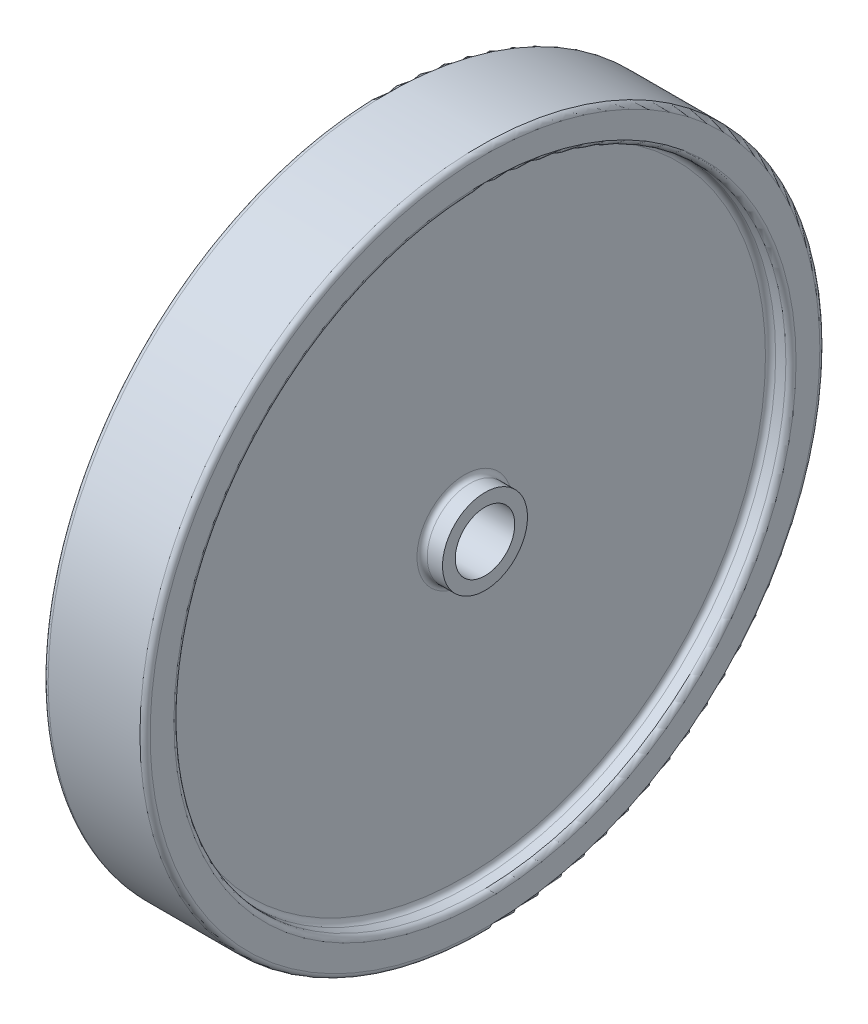
ISO-10303-21;
HEADER;
FILE_DESCRIPTION(('STEP AP214'),'2;1');
FILE_NAME('part.step','',(''),(''),'','','');
FILE_SCHEMA(('AUTOMOTIVE_DESIGN { 1 0 10303 214 1 1 1 1 }'));
ENDSEC;
DATA;
#1=APPLICATION_CONTEXT('core data for automotive mechanical design processes');
#2=APPLICATION_PROTOCOL_DEFINITION('international standard','automotive_design',2000,#1);
#3=PRODUCT_CONTEXT('',#1,'mechanical');
#4=PRODUCT('Part','Part','',(#3));
#5=PRODUCT_RELATED_PRODUCT_CATEGORY('part','',(#4));
#6=PRODUCT_DEFINITION_FORMATION('','',#4);
#7=PRODUCT_DEFINITION_CONTEXT('part definition',#1,'design');
#8=PRODUCT_DEFINITION('design','',#6,#7);
#9=PRODUCT_DEFINITION_SHAPE('','',#8);
#10=(LENGTH_UNIT() NAMED_UNIT(*) SI_UNIT(.MILLI.,.METRE.));
#11=(NAMED_UNIT(*) PLANE_ANGLE_UNIT() SI_UNIT($,.RADIAN.));
#12=(NAMED_UNIT(*) SI_UNIT($,.STERADIAN.) SOLID_ANGLE_UNIT());
#13=UNCERTAINTY_MEASURE_WITH_UNIT(LENGTH_MEASURE(1.E-05),#10,'distance_accuracy_value','');
#14=(GEOMETRIC_REPRESENTATION_CONTEXT(3) GLOBAL_UNCERTAINTY_ASSIGNED_CONTEXT((#13)) GLOBAL_UNIT_ASSIGNED_CONTEXT((#10,
#11,#12)) REPRESENTATION_CONTEXT('',''));
#15=CARTESIAN_POINT('',(0.,0.,0.));
#16=DIRECTION('',(0.,0.,1.));
#17=DIRECTION('',(1.,0.,0.));
#18=AXIS2_PLACEMENT_3D('',#15,#16,#17);
#19=CARTESIAN_POINT('',(0.,0.,0.));
#20=DIRECTION('',(1.,0.,0.));
#21=DIRECTION('',(0.,0.,-1.));
#22=AXIS2_PLACEMENT_3D('',#19,#20,#21);
#23=PLANE('',#22);
#24=CARTESIAN_POINT('',(0.,0.,0.));
#25=DIRECTION('',(1.,0.,0.));
#26=DIRECTION('',(0.,0.,-1.));
#27=AXIS2_PLACEMENT_3D('',#24,#25,#26);
#28=CIRCLE('',#27,17.5);
#29=CARTESIAN_POINT('',(0.,0.,-17.5));
#30=VERTEX_POINT('',#29);
#31=EDGE_CURVE('E91',#30,#30,#28,.T.);
#32=ORIENTED_EDGE('',*,*,#31,.T.);
#33=EDGE_LOOP('',(#32));
#34=FACE_BOUND('',#33,.T.);
#35=CARTESIAN_POINT('',(0.,0.,0.));
#36=DIRECTION('',(1.,0.,0.));
#37=DIRECTION('',(0.,0.,-1.));
#38=AXIS2_PLACEMENT_3D('',#35,#36,#37);
#39=CIRCLE('',#38,25.);
#40=CARTESIAN_POINT('',(0.,0.,-25.));
#41=VERTEX_POINT('',#40);
#42=EDGE_CURVE('E99',#41,#41,#39,.T.);
#43=ORIENTED_EDGE('',*,*,#42,.F.);
#44=EDGE_LOOP('',(#43));
#45=FACE_BOUND('',#44,.T.);
#46=ADVANCED_FACE('F34',(#34,#45),#23,.F.);
#47=CARTESIAN_POINT('',(60.,0.,0.));
#48=DIRECTION('',(1.,0.,0.));
#49=DIRECTION('',(0.,0.,-1.));
#50=AXIS2_PLACEMENT_3D('',#47,#48,#49);
#51=PLANE('',#50);
#52=CARTESIAN_POINT('',(60.,0.,0.));
#53=DIRECTION('',(1.,0.,0.));
#54=DIRECTION('',(0.,0.,-1.));
#55=AXIS2_PLACEMENT_3D('',#52,#53,#54);
#56=CIRCLE('',#55,17.5);
#57=CARTESIAN_POINT('',(60.,0.,-17.5));
#58=VERTEX_POINT('',#57);
#59=EDGE_CURVE('E90',#58,#58,#56,.T.);
#60=ORIENTED_EDGE('',*,*,#59,.F.);
#61=EDGE_LOOP('',(#60));
#62=FACE_BOUND('',#61,.T.);
#63=CARTESIAN_POINT('',(60.,0.,0.));
#64=DIRECTION('',(1.,0.,0.));
#65=DIRECTION('',(0.,0.,-1.));
#66=AXIS2_PLACEMENT_3D('',#63,#64,#65);
#67=CIRCLE('',#66,25.);
#68=CARTESIAN_POINT('',(60.,0.,-25.));
#69=VERTEX_POINT('',#68);
#70=EDGE_CURVE('E94',#69,#69,#67,.T.);
#71=ORIENTED_EDGE('',*,*,#70,.T.);
#72=EDGE_LOOP('',(#71));
#73=FACE_BOUND('',#72,.T.);
#74=ADVANCED_FACE('F106',(#62,#73),#51,.T.);
#75=CARTESIAN_POINT('',(60.,0.,0.));
#76=DIRECTION('',(1.,0.,0.));
#77=DIRECTION('',(0.,0.,-1.));
#78=AXIS2_PLACEMENT_3D('',#75,#76,#77);
#79=CIRCLE('',#78,183.);
#80=CARTESIAN_POINT('',(60.,0.,-183.));
#81=VERTEX_POINT('',#80);
#82=EDGE_CURVE('E60',#81,#81,#79,.F.);
#83=ORIENTED_EDGE('',*,*,#82,.T.);
#84=EDGE_LOOP('',(#83));
#85=FACE_BOUND('',#84,.T.);
#86=CARTESIAN_POINT('',(60.,0.,0.));
#87=DIRECTION('',(1.,0.,0.));
#88=DIRECTION('',(0.,0.,-1.));
#89=AXIS2_PLACEMENT_3D('',#86,#87,#88);
#90=CIRCLE('',#89,197.);
#91=CARTESIAN_POINT('',(60.,0.,-197.));
#92=VERTEX_POINT('',#91);
#93=EDGE_CURVE('E78',#92,#92,#90,.T.);
#94=ORIENTED_EDGE('',*,*,#93,.T.);
#95=EDGE_LOOP('',(#94));
#96=FACE_BOUND('',#95,.T.);
#97=ADVANCED_FACE('F113',(#85,#96),#51,.T.);
#98=CARTESIAN_POINT('',(0.,0.,0.));
#99=DIRECTION('',(1.,0.,0.));
#100=DIRECTION('',(0.,0.,-1.));
#101=AXIS2_PLACEMENT_3D('',#98,#99,#100);
#102=CIRCLE('',#101,183.);
#103=CARTESIAN_POINT('',(0.,0.,-183.));
#104=VERTEX_POINT('',#103);
#105=EDGE_CURVE('E57',#104,#104,#102,.T.);
#106=ORIENTED_EDGE('',*,*,#105,.T.);
#107=EDGE_LOOP('',(#106));
#108=FACE_BOUND('',#107,.T.);
#109=CARTESIAN_POINT('',(0.,0.,0.));
#110=DIRECTION('',(1.,0.,0.));
#111=DIRECTION('',(0.,0.,-1.));
#112=AXIS2_PLACEMENT_3D('',#109,#110,#111);
#113=CIRCLE('',#112,197.);
#114=CARTESIAN_POINT('',(0.,0.,-197.));
#115=VERTEX_POINT('',#114);
#116=EDGE_CURVE('E81',#115,#115,#113,.F.);
#117=ORIENTED_EDGE('',*,*,#116,.T.);
#118=EDGE_LOOP('',(#117));
#119=FACE_BOUND('',#118,.T.);
#120=ADVANCED_FACE('F109',(#108,#119),#23,.F.);
#121=CARTESIAN_POINT('',(60.,0.,0.));
#122=DIRECTION('',(-1.,0.,0.));
#123=DIRECTION('',(0.,0.,1.));
#124=AXIS2_PLACEMENT_3D('',#121,#122,#123);
#125=CYLINDRICAL_SURFACE('',#124,200.);
#126=CARTESIAN_POINT('',(3.,0.,0.));
#127=DIRECTION('',(1.,0.,0.));
#128=DIRECTION('',(0.,0.,-1.));
#129=AXIS2_PLACEMENT_3D('',#126,#127,#128);
#130=CIRCLE('',#129,200.);
#131=CARTESIAN_POINT('',(3.,0.,-200.));
#132=VERTEX_POINT('',#131);
#133=EDGE_CURVE('E84',#132,#132,#130,.T.);
#134=ORIENTED_EDGE('',*,*,#133,.T.);
#135=EDGE_LOOP('',(#134));
#136=FACE_BOUND('',#135,.T.);
#137=CARTESIAN_POINT('',(57.,0.,0.));
#138=DIRECTION('',(1.,0.,0.));
#139=DIRECTION('',(0.,0.,-1.));
#140=AXIS2_PLACEMENT_3D('',#137,#138,#139);
#141=CIRCLE('',#140,200.);
#142=CARTESIAN_POINT('',(57.,0.,-200.));
#143=VERTEX_POINT('',#142);
#144=EDGE_CURVE('E87',#143,#143,#141,.F.);
#145=ORIENTED_EDGE('',*,*,#144,.T.);
#146=EDGE_LOOP('',(#145));
#147=FACE_BOUND('',#146,.T.);
#148=ADVANCED_FACE('F118',(#136,#147),#125,.T.);
#149=CARTESIAN_POINT('',(60.,0.,0.));
#150=DIRECTION('',(-1.,0.,0.));
#151=DIRECTION('',(0.,0.,1.));
#152=AXIS2_PLACEMENT_3D('',#149,#150,#151);
#153=CYLINDRICAL_SURFACE('',#152,17.5);
#154=ORIENTED_EDGE('',*,*,#59,.T.);
#155=EDGE_LOOP('',(#154));
#156=FACE_BOUND('',#155,.T.);
#157=ORIENTED_EDGE('',*,*,#31,.F.);
#158=EDGE_LOOP('',(#157));
#159=FACE_BOUND('',#158,.T.);
#160=ADVANCED_FACE('F124',(#156,#159),#153,.F.);
#161=CARTESIAN_POINT('',(3.,0.,0.));
#162=DIRECTION('',(1.,0.,0.));
#163=DIRECTION('',(0.,0.,-1.));
#164=AXIS2_PLACEMENT_3D('',#161,#162,#163);
#165=TOROIDAL_SURFACE('',#164,197.,3.);
#166=ORIENTED_EDGE('',*,*,#116,.F.);
#167=EDGE_LOOP('',(#166));
#168=FACE_BOUND('',#167,.T.);
#169=ORIENTED_EDGE('',*,*,#133,.F.);
#170=EDGE_LOOP('',(#169));
#171=FACE_BOUND('',#170,.T.);
#172=ADVANCED_FACE('F131',(#168,#171),#165,.T.);
#173=CARTESIAN_POINT('',(57.,0.,0.));
#174=DIRECTION('',(1.,0.,0.));
#175=DIRECTION('',(0.,0.,-1.));
#176=AXIS2_PLACEMENT_3D('',#173,#174,#175);
#177=TOROIDAL_SURFACE('',#176,197.,3.);
#178=ORIENTED_EDGE('',*,*,#144,.F.);
#179=EDGE_LOOP('',(#178));
#180=FACE_BOUND('',#179,.T.);
#181=ORIENTED_EDGE('',*,*,#93,.F.);
#182=EDGE_LOOP('',(#181));
#183=FACE_BOUND('',#182,.T.);
#184=ADVANCED_FACE('F134',(#180,#183),#177,.T.);
#185=CARTESIAN_POINT('',(48.,0.,0.));
#186=DIRECTION('',(1.,0.,0.));
#187=DIRECTION('',(0.,0.,-1.));
#188=AXIS2_PLACEMENT_3D('',#185,#186,#187);
#189=CYLINDRICAL_SURFACE('',#188,180.);
#190=CARTESIAN_POINT('',(51.,0.,0.));
#191=DIRECTION('',(1.,0.,0.));
#192=DIRECTION('',(0.,0.,-1.));
#193=AXIS2_PLACEMENT_3D('',#190,#191,#192);
#194=CIRCLE('',#193,180.);
#195=CARTESIAN_POINT('',(51.,0.,-180.));
#196=VERTEX_POINT('',#195);
#197=EDGE_CURVE('E63',#196,#196,#194,.F.);
#198=ORIENTED_EDGE('',*,*,#197,.T.);
#199=EDGE_LOOP('',(#198));
#200=FACE_BOUND('',#199,.T.);
#201=CARTESIAN_POINT('',(57.,0.,0.));
#202=DIRECTION('',(1.,0.,0.));
#203=DIRECTION('',(0.,0.,-1.));
#204=AXIS2_PLACEMENT_3D('',#201,#202,#203);
#205=CIRCLE('',#204,180.);
#206=CARTESIAN_POINT('',(57.,0.,-180.));
#207=VERTEX_POINT('',#206);
#208=EDGE_CURVE('E66',#207,#207,#205,.T.);
#209=ORIENTED_EDGE('',*,*,#208,.T.);
#210=EDGE_LOOP('',(#209));
#211=FACE_BOUND('',#210,.T.);
#212=ADVANCED_FACE('F142',(#200,#211),#189,.F.);
#213=CARTESIAN_POINT('',(48.,0.,0.));
#214=DIRECTION('',(1.,0.,0.));
#215=DIRECTION('',(0.,0.,-1.));
#216=AXIS2_PLACEMENT_3D('',#213,#214,#215);
#217=PLANE('',#216);
#218=CARTESIAN_POINT('',(48.,0.,0.));
#219=DIRECTION('',(1.,0.,0.));
#220=DIRECTION('',(0.,0.,-1.));
#221=AXIS2_PLACEMENT_3D('',#218,#219,#220);
#222=CIRCLE('',#221,28.);
#223=CARTESIAN_POINT('',(48.,0.,-28.));
#224=VERTEX_POINT('',#223);
#225=EDGE_CURVE('E69',#224,#224,#222,.F.);
#226=ORIENTED_EDGE('',*,*,#225,.T.);
#227=EDGE_LOOP('',(#226));
#228=FACE_BOUND('',#227,.T.);
#229=CARTESIAN_POINT('',(48.,0.,0.));
#230=DIRECTION('',(1.,0.,0.));
#231=DIRECTION('',(0.,0.,-1.));
#232=AXIS2_PLACEMENT_3D('',#229,#230,#231);
#233=CIRCLE('',#232,177.);
#234=CARTESIAN_POINT('',(48.,0.,-177.));
#235=VERTEX_POINT('',#234);
#236=EDGE_CURVE('E72',#235,#235,#233,.T.);
#237=ORIENTED_EDGE('',*,*,#236,.T.);
#238=EDGE_LOOP('',(#237));
#239=FACE_BOUND('',#238,.T.);
#240=ADVANCED_FACE('F149',(#228,#239),#217,.T.);
#241=CARTESIAN_POINT('',(48.,0.,0.));
#242=DIRECTION('',(1.,0.,0.));
#243=DIRECTION('',(0.,0.,-1.));
#244=AXIS2_PLACEMENT_3D('',#241,#242,#243);
#245=CYLINDRICAL_SURFACE('',#244,25.);
#246=CARTESIAN_POINT('',(51.,0.,0.));
#247=DIRECTION('',(1.,0.,0.));
#248=DIRECTION('',(0.,0.,-1.));
#249=AXIS2_PLACEMENT_3D('',#246,#247,#248);
#250=CIRCLE('',#249,25.);
#251=CARTESIAN_POINT('',(51.,0.,-25.));
#252=VERTEX_POINT('',#251);
#253=EDGE_CURVE('E75',#252,#252,#250,.T.);
#254=ORIENTED_EDGE('',*,*,#253,.T.);
#255=EDGE_LOOP('',(#254));
#256=FACE_BOUND('',#255,.T.);
#257=ORIENTED_EDGE('',*,*,#70,.F.);
#258=EDGE_LOOP('',(#257));
#259=FACE_BOUND('',#258,.T.);
#260=ADVANCED_FACE('F157',(#256,#259),#245,.T.);
#261=CARTESIAN_POINT('',(51.,0.,0.));
#262=DIRECTION('',(1.,0.,0.));
#263=DIRECTION('',(0.,0.,-1.));
#264=AXIS2_PLACEMENT_3D('',#261,#262,#263);
#265=TOROIDAL_SURFACE('',#264,28.,3.);
#266=ORIENTED_EDGE('',*,*,#225,.F.);
#267=EDGE_LOOP('',(#266));
#268=FACE_BOUND('',#267,.T.);
#269=ORIENTED_EDGE('',*,*,#253,.F.);
#270=EDGE_LOOP('',(#269));
#271=FACE_BOUND('',#270,.T.);
#272=ADVANCED_FACE('F153',(#268,#271),#265,.F.);
#273=CARTESIAN_POINT('',(51.,0.,0.));
#274=DIRECTION('',(1.,0.,0.));
#275=DIRECTION('',(0.,0.,-1.));
#276=AXIS2_PLACEMENT_3D('',#273,#274,#275);
#277=TOROIDAL_SURFACE('',#276,177.,3.);
#278=ORIENTED_EDGE('',*,*,#197,.F.);
#279=EDGE_LOOP('',(#278));
#280=FACE_BOUND('',#279,.T.);
#281=ORIENTED_EDGE('',*,*,#236,.F.);
#282=EDGE_LOOP('',(#281));
#283=FACE_BOUND('',#282,.T.);
#284=ADVANCED_FACE('F156',(#280,#283),#277,.F.);
#285=CARTESIAN_POINT('',(57.,0.,0.));
#286=DIRECTION('',(1.,0.,0.));
#287=DIRECTION('',(0.,0.,-1.));
#288=AXIS2_PLACEMENT_3D('',#285,#286,#287);
#289=TOROIDAL_SURFACE('',#288,183.,3.);
#290=ORIENTED_EDGE('',*,*,#82,.F.);
#291=EDGE_LOOP('',(#290));
#292=FACE_BOUND('',#291,.T.);
#293=ORIENTED_EDGE('',*,*,#208,.F.);
#294=EDGE_LOOP('',(#293));
#295=FACE_BOUND('',#294,.T.);
#296=ADVANCED_FACE('F161',(#292,#295),#289,.T.);
#297=CARTESIAN_POINT('',(12.,0.,0.));
#298=DIRECTION('',(-1.,0.,0.));
#299=DIRECTION('',(0.,0.,-1.));
#300=AXIS2_PLACEMENT_3D('',#297,#298,#299);
#301=PLANE('',#300);
#302=CARTESIAN_POINT('',(12.,0.,0.));
#303=DIRECTION('',(-1.,0.,0.));
#304=DIRECTION('',(0.,0.,1.));
#305=AXIS2_PLACEMENT_3D('',#302,#303,#304);
#306=CIRCLE('',#305,177.);
#307=CARTESIAN_POINT('',(12.,0.,177.));
#308=VERTEX_POINT('',#307);
#309=EDGE_CURVE('E41',#308,#308,#306,.T.);
#310=ORIENTED_EDGE('',*,*,#309,.T.);
#311=EDGE_LOOP('',(#310));
#312=FACE_BOUND('',#311,.T.);
#313=CARTESIAN_POINT('',(12.,0.,0.));
#314=DIRECTION('',(-1.,0.,0.));
#315=DIRECTION('',(0.,0.,1.));
#316=AXIS2_PLACEMENT_3D('',#313,#314,#315);
#317=CIRCLE('',#316,28.);
#318=CARTESIAN_POINT('',(12.,0.,28.));
#319=VERTEX_POINT('',#318);
#320=EDGE_CURVE('E45',#319,#319,#317,.F.);
#321=ORIENTED_EDGE('',*,*,#320,.T.);
#322=EDGE_LOOP('',(#321));
#323=FACE_BOUND('',#322,.T.);
#324=ADVANCED_FACE('F165',(#312,#323),#301,.T.);
#325=CARTESIAN_POINT('',(12.,0.,0.));
#326=DIRECTION('',(-1.,0.,0.));
#327=DIRECTION('',(0.,0.,1.));
#328=AXIS2_PLACEMENT_3D('',#325,#326,#327);
#329=CYLINDRICAL_SURFACE('',#328,180.);
#330=CARTESIAN_POINT('',(3.,0.,0.));
#331=DIRECTION('',(1.,0.,0.));
#332=DIRECTION('',(0.,0.,-1.));
#333=AXIS2_PLACEMENT_3D('',#330,#331,#332);
#334=CIRCLE('',#333,180.);
#335=CARTESIAN_POINT('',(3.,0.,-180.));
#336=VERTEX_POINT('',#335);
#337=EDGE_CURVE('E49',#336,#336,#334,.F.);
#338=ORIENTED_EDGE('',*,*,#337,.T.);
#339=EDGE_LOOP('',(#338));
#340=FACE_BOUND('',#339,.T.);
#341=CARTESIAN_POINT('',(9.,0.,0.));
#342=DIRECTION('',(-1.,0.,0.));
#343=DIRECTION('',(0.,0.,1.));
#344=AXIS2_PLACEMENT_3D('',#341,#342,#343);
#345=CIRCLE('',#344,180.);
#346=CARTESIAN_POINT('',(9.,0.,180.));
#347=VERTEX_POINT('',#346);
#348=EDGE_CURVE('E54',#347,#347,#345,.F.);
#349=ORIENTED_EDGE('',*,*,#348,.T.);
#350=EDGE_LOOP('',(#349));
#351=FACE_BOUND('',#350,.T.);
#352=ADVANCED_FACE('F180',(#340,#351),#329,.F.);
#353=CARTESIAN_POINT('',(12.,0.,0.));
#354=DIRECTION('',(-1.,0.,0.));
#355=DIRECTION('',(0.,0.,1.));
#356=AXIS2_PLACEMENT_3D('',#353,#354,#355);
#357=CYLINDRICAL_SURFACE('',#356,25.);
#358=CARTESIAN_POINT('',(9.,0.,0.));
#359=DIRECTION('',(-1.,0.,0.));
#360=DIRECTION('',(0.,0.,1.));
#361=AXIS2_PLACEMENT_3D('',#358,#359,#360);
#362=CIRCLE('',#361,25.);
#363=CARTESIAN_POINT('',(9.,0.,25.));
#364=VERTEX_POINT('',#363);
#365=EDGE_CURVE('E10',#364,#364,#362,.T.);
#366=ORIENTED_EDGE('',*,*,#365,.T.);
#367=EDGE_LOOP('',(#366));
#368=FACE_BOUND('',#367,.T.);
#369=ORIENTED_EDGE('',*,*,#42,.T.);
#370=EDGE_LOOP('',(#369));
#371=FACE_BOUND('',#370,.T.);
#372=ADVANCED_FACE('F103',(#368,#371),#357,.T.);
#373=CARTESIAN_POINT('',(3.,0.,0.));
#374=DIRECTION('',(1.,0.,0.));
#375=DIRECTION('',(0.,0.,-1.));
#376=AXIS2_PLACEMENT_3D('',#373,#374,#375);
#377=TOROIDAL_SURFACE('',#376,183.,3.);
#378=ORIENTED_EDGE('',*,*,#337,.F.);
#379=EDGE_LOOP('',(#378));
#380=FACE_BOUND('',#379,.T.);
#381=ORIENTED_EDGE('',*,*,#105,.F.);
#382=EDGE_LOOP('',(#381));
#383=FACE_BOUND('',#382,.T.);
#384=ADVANCED_FACE('F167',(#380,#383),#377,.T.);
#385=CARTESIAN_POINT('',(9.,0.,0.));
#386=DIRECTION('',(-1.,0.,0.));
#387=DIRECTION('',(0.,0.,1.));
#388=AXIS2_PLACEMENT_3D('',#385,#386,#387);
#389=TOROIDAL_SURFACE('',#388,177.,3.);
#390=ORIENTED_EDGE('',*,*,#309,.F.);
#391=EDGE_LOOP('',(#390));
#392=FACE_BOUND('',#391,.T.);
#393=ORIENTED_EDGE('',*,*,#348,.F.);
#394=EDGE_LOOP('',(#393));
#395=FACE_BOUND('',#394,.T.);
#396=ADVANCED_FACE('F169',(#392,#395),#389,.F.);
#397=CARTESIAN_POINT('',(9.,0.,0.));
#398=DIRECTION('',(-1.,0.,0.));
#399=DIRECTION('',(0.,0.,1.));
#400=AXIS2_PLACEMENT_3D('',#397,#398,#399);
#401=TOROIDAL_SURFACE('',#400,28.,3.);
#402=ORIENTED_EDGE('',*,*,#365,.F.);
#403=EDGE_LOOP('',(#402));
#404=FACE_BOUND('',#403,.T.);
#405=ORIENTED_EDGE('',*,*,#320,.F.);
#406=EDGE_LOOP('',(#405));
#407=FACE_BOUND('',#406,.T.);
#408=ADVANCED_FACE('F36',(#404,#407),#401,.F.);
#409=CLOSED_SHELL('',(#46,#74,#97,#120,#148,#160,#172,#184,#212,#240,#260,#272,#284,#296,#324,
#352,#372,#384,#396,#408));
#410=MANIFOLD_SOLID_BREP('B2',#409);
#411=ADVANCED_BREP_SHAPE_REPRESENTATION('',(#18,#410),#14);
#412=SHAPE_DEFINITION_REPRESENTATION(#9,#411);
ENDSEC;
END-ISO-10303-21;
